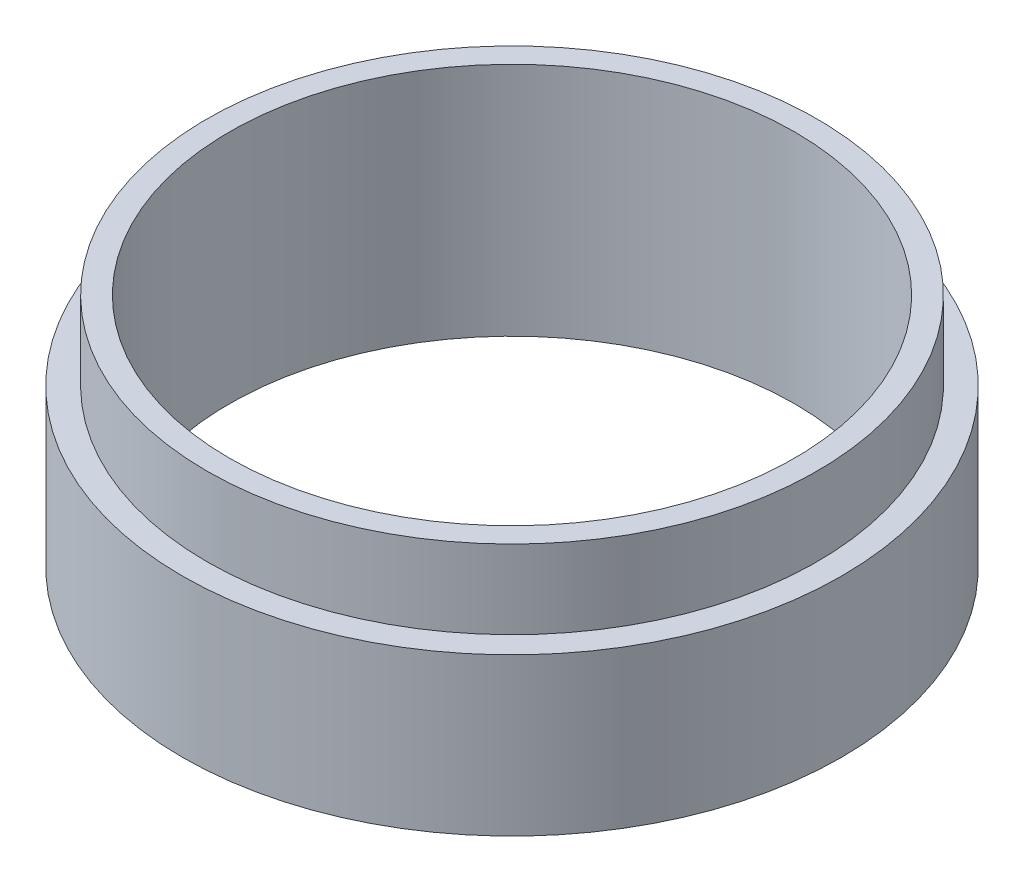
ISO-10303-21;
HEADER;
FILE_DESCRIPTION(('STEP AP214'),'2;1');
FILE_NAME('part.step','',(''),(''),'','','');
FILE_SCHEMA(('AUTOMOTIVE_DESIGN { 1 0 10303 214 1 1 1 1 }'));
ENDSEC;
DATA;
#1=APPLICATION_CONTEXT('core data for automotive mechanical design processes');
#2=APPLICATION_PROTOCOL_DEFINITION('international standard','automotive_design',2000,#1);
#3=PRODUCT_CONTEXT('',#1,'mechanical');
#4=PRODUCT('Part','Part','',(#3));
#5=PRODUCT_RELATED_PRODUCT_CATEGORY('part','',(#4));
#6=PRODUCT_DEFINITION_FORMATION('','',#4);
#7=PRODUCT_DEFINITION_CONTEXT('part definition',#1,'design');
#8=PRODUCT_DEFINITION('design','',#6,#7);
#9=PRODUCT_DEFINITION_SHAPE('','',#8);
#10=(LENGTH_UNIT() NAMED_UNIT(*) SI_UNIT(.MILLI.,.METRE.));
#11=(NAMED_UNIT(*) PLANE_ANGLE_UNIT() SI_UNIT($,.RADIAN.));
#12=(NAMED_UNIT(*) SI_UNIT($,.STERADIAN.) SOLID_ANGLE_UNIT());
#13=UNCERTAINTY_MEASURE_WITH_UNIT(LENGTH_MEASURE(1.E-05),#10,'distance_accuracy_value','');
#14=(GEOMETRIC_REPRESENTATION_CONTEXT(3) GLOBAL_UNCERTAINTY_ASSIGNED_CONTEXT((#13)) GLOBAL_UNIT_ASSIGNED_CONTEXT((#10,
#11,#12)) REPRESENTATION_CONTEXT('',''));
#15=CARTESIAN_POINT('',(0.,0.,0.));
#16=DIRECTION('',(0.,0.,1.));
#17=DIRECTION('',(1.,0.,0.));
#18=AXIS2_PLACEMENT_3D('',#15,#16,#17);
#19=CARTESIAN_POINT('',(0.,0.,0.));
#20=DIRECTION('',(0.,-1.,0.));
#21=DIRECTION('',(0.,0.,-1.));
#22=AXIS2_PLACEMENT_3D('',#19,#20,#21);
#23=CYLINDRICAL_SURFACE('',#22,21.);
#24=CARTESIAN_POINT('',(0.,10.,0.));
#25=DIRECTION('',(0.,-1.,0.));
#26=DIRECTION('',(0.,0.,-1.));
#27=AXIS2_PLACEMENT_3D('',#24,#25,#26);
#28=CIRCLE('',#27,21.);
#29=CARTESIAN_POINT('',(0.,10.,-21.));
#30=VERTEX_POINT('',#29);
#31=EDGE_CURVE('E37',#30,#30,#28,.T.);
#32=ORIENTED_EDGE('',*,*,#31,.T.);
#33=EDGE_LOOP('',(#32));
#34=FACE_BOUND('',#33,.T.);
#35=CARTESIAN_POINT('',(0.,0.,0.));
#36=DIRECTION('',(0.,-1.,0.));
#37=DIRECTION('',(0.,0.,-1.));
#38=AXIS2_PLACEMENT_3D('',#35,#36,#37);
#39=CIRCLE('',#38,21.);
#40=CARTESIAN_POINT('',(0.,0.,-21.));
#41=VERTEX_POINT('',#40);
#42=EDGE_CURVE('E48',#41,#41,#39,.T.);
#43=ORIENTED_EDGE('',*,*,#42,.F.);
#44=EDGE_LOOP('',(#43));
#45=FACE_BOUND('',#44,.T.);
#46=ADVANCED_FACE('F40',(#34,#45),#23,.T.);
#47=CARTESIAN_POINT('',(0.,10.,0.));
#48=DIRECTION('',(0.,1.,0.));
#49=DIRECTION('',(0.,0.,1.));
#50=AXIS2_PLACEMENT_3D('',#47,#48,#49);
#51=PLANE('',#50);
#52=CARTESIAN_POINT('',(0.,10.,0.));
#53=DIRECTION('',(0.,1.,0.));
#54=DIRECTION('',(0.,0.,1.));
#55=AXIS2_PLACEMENT_3D('',#52,#53,#54);
#56=CIRCLE('',#55,19.43);
#57=CARTESIAN_POINT('',(0.,10.,19.43));
#58=VERTEX_POINT('',#57);
#59=EDGE_CURVE('E10',#58,#58,#56,.T.);
#60=ORIENTED_EDGE('',*,*,#59,.F.);
#61=EDGE_LOOP('',(#60));
#62=FACE_BOUND('',#61,.T.);
#63=ORIENTED_EDGE('',*,*,#31,.F.);
#64=EDGE_LOOP('',(#63));
#65=FACE_BOUND('',#64,.T.);
#66=ADVANCED_FACE('F61',(#62,#65),#51,.T.);
#67=CARTESIAN_POINT('',(0.,0.,0.));
#68=DIRECTION('',(0.,-1.,0.));
#69=DIRECTION('',(0.,0.,-1.));
#70=AXIS2_PLACEMENT_3D('',#67,#68,#69);
#71=PLANE('',#70);
#72=CARTESIAN_POINT('',(0.,0.,0.));
#73=DIRECTION('',(0.,1.,0.));
#74=DIRECTION('',(0.,0.,1.));
#75=AXIS2_PLACEMENT_3D('',#72,#73,#74);
#76=CIRCLE('',#75,18.);
#77=CARTESIAN_POINT('',(0.,0.,18.));
#78=VERTEX_POINT('',#77);
#79=EDGE_CURVE('E52',#78,#78,#76,.T.);
#80=ORIENTED_EDGE('',*,*,#79,.T.);
#81=EDGE_LOOP('',(#80));
#82=FACE_BOUND('',#81,.T.);
#83=ORIENTED_EDGE('',*,*,#42,.T.);
#84=EDGE_LOOP('',(#83));
#85=FACE_BOUND('',#84,.T.);
#86=ADVANCED_FACE('F59',(#82,#85),#71,.T.);
#87=CARTESIAN_POINT('',(0.,0.,0.));
#88=DIRECTION('',(0.,1.,0.));
#89=DIRECTION('',(0.,0.,1.));
#90=AXIS2_PLACEMENT_3D('',#87,#88,#89);
#91=CYLINDRICAL_SURFACE('',#90,18.);
#92=ORIENTED_EDGE('',*,*,#79,.F.);
#93=EDGE_LOOP('',(#92));
#94=FACE_BOUND('',#93,.T.);
#95=CARTESIAN_POINT('',(0.,15.,0.));
#96=DIRECTION('',(0.,1.,0.));
#97=DIRECTION('',(0.,0.,1.));
#98=AXIS2_PLACEMENT_3D('',#95,#96,#97);
#99=CIRCLE('',#98,18.);
#100=CARTESIAN_POINT('',(0.,15.,18.));
#101=VERTEX_POINT('',#100);
#102=EDGE_CURVE('E93',#101,#101,#99,.T.);
#103=ORIENTED_EDGE('',*,*,#102,.T.);
#104=EDGE_LOOP('',(#103));
#105=FACE_BOUND('',#104,.T.);
#106=ADVANCED_FACE('F71',(#94,#105),#91,.F.);
#107=CARTESIAN_POINT('',(0.,15.,0.));
#108=DIRECTION('',(0.,1.,0.));
#109=DIRECTION('',(0.,0.,1.));
#110=AXIS2_PLACEMENT_3D('',#107,#108,#109);
#111=PLANE('',#110);
#112=ORIENTED_EDGE('',*,*,#102,.F.);
#113=EDGE_LOOP('',(#112));
#114=FACE_BOUND('',#113,.T.);
#115=CARTESIAN_POINT('',(0.,15.,0.));
#116=DIRECTION('',(0.,1.,0.));
#117=DIRECTION('',(0.,0.,1.));
#118=AXIS2_PLACEMENT_3D('',#115,#116,#117);
#119=CIRCLE('',#118,19.43);
#120=CARTESIAN_POINT('',(0.,15.,19.43));
#121=VERTEX_POINT('',#120);
#122=EDGE_CURVE('E51',#121,#121,#119,.T.);
#123=ORIENTED_EDGE('',*,*,#122,.T.);
#124=EDGE_LOOP('',(#123));
#125=FACE_BOUND('',#124,.T.);
#126=ADVANCED_FACE('F78',(#114,#125),#111,.T.);
#127=CARTESIAN_POINT('',(0.,15.,0.));
#128=DIRECTION('',(0.,-1.,0.));
#129=DIRECTION('',(0.,0.,-1.));
#130=AXIS2_PLACEMENT_3D('',#127,#128,#129);
#131=CYLINDRICAL_SURFACE('',#130,19.43);
#132=ORIENTED_EDGE('',*,*,#122,.F.);
#133=EDGE_LOOP('',(#132));
#134=FACE_BOUND('',#133,.T.);
#135=ORIENTED_EDGE('',*,*,#59,.T.);
#136=EDGE_LOOP('',(#135));
#137=FACE_BOUND('',#136,.T.);
#138=ADVANCED_FACE('F83',(#134,#137),#131,.T.);
#139=CLOSED_SHELL('',(#46,#66,#86,#106,#126,#138));
#140=MANIFOLD_SOLID_BREP('B2',#139);
#141=ADVANCED_BREP_SHAPE_REPRESENTATION('',(#18,#140),#14);
#142=SHAPE_DEFINITION_REPRESENTATION(#9,#141);
ENDSEC;
END-ISO-10303-21;
